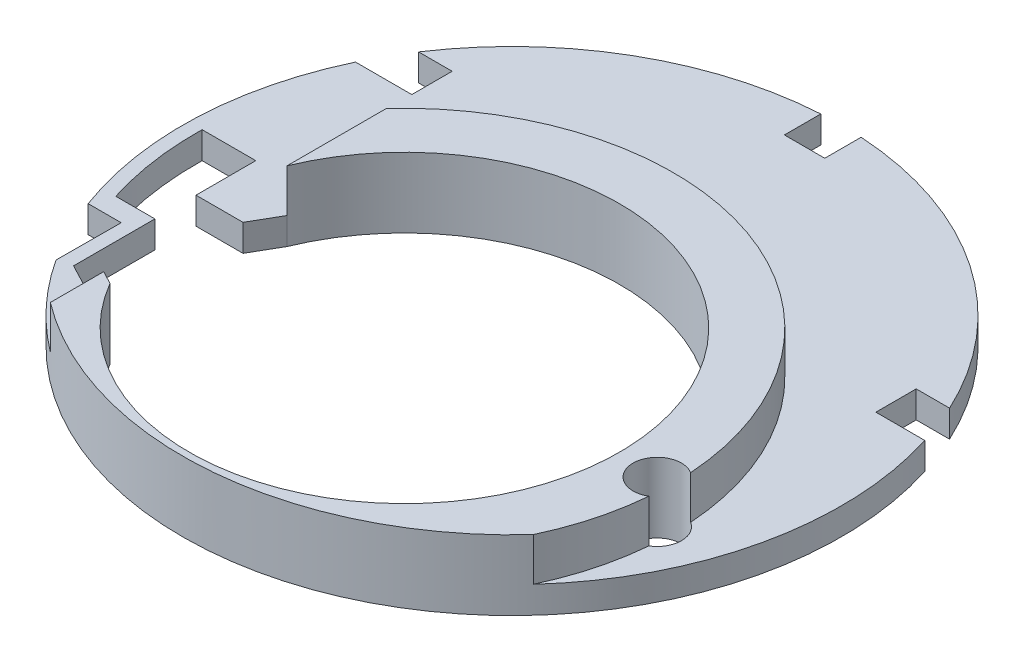
ISO-10303-21;
HEADER;
FILE_DESCRIPTION(('STEP AP214'),'2;1');
FILE_NAME('part.step','',(''),(''),'','','');
FILE_SCHEMA(('AUTOMOTIVE_DESIGN { 1 0 10303 214 1 1 1 1 }'));
ENDSEC;
DATA;
#1=APPLICATION_CONTEXT('core data for automotive mechanical design processes');
#2=APPLICATION_PROTOCOL_DEFINITION('international standard','automotive_design',2000,#1);
#3=PRODUCT_CONTEXT('',#1,'mechanical');
#4=PRODUCT('Part','Part','',(#3));
#5=PRODUCT_RELATED_PRODUCT_CATEGORY('part','',(#4));
#6=PRODUCT_DEFINITION_FORMATION('','',#4);
#7=PRODUCT_DEFINITION_CONTEXT('part definition',#1,'design');
#8=PRODUCT_DEFINITION('design','',#6,#7);
#9=PRODUCT_DEFINITION_SHAPE('','',#8);
#10=(LENGTH_UNIT() NAMED_UNIT(*) SI_UNIT(.MILLI.,.METRE.));
#11=(NAMED_UNIT(*) PLANE_ANGLE_UNIT() SI_UNIT($,.RADIAN.));
#12=(NAMED_UNIT(*) SI_UNIT($,.STERADIAN.) SOLID_ANGLE_UNIT());
#13=UNCERTAINTY_MEASURE_WITH_UNIT(LENGTH_MEASURE(1.E-05),#10,'distance_accuracy_value','');
#14=(GEOMETRIC_REPRESENTATION_CONTEXT(3) GLOBAL_UNCERTAINTY_ASSIGNED_CONTEXT((#13)) GLOBAL_UNIT_ASSIGNED_CONTEXT((#10,
#11,#12)) REPRESENTATION_CONTEXT('',''));
#15=CARTESIAN_POINT('',(0.,0.,0.));
#16=DIRECTION('',(0.,0.,1.));
#17=DIRECTION('',(1.,0.,0.));
#18=AXIS2_PLACEMENT_3D('',#15,#16,#17);
#19=CARTESIAN_POINT('',(0.,1.,0.));
#20=DIRECTION('',(0.,1.,0.));
#21=DIRECTION('',(0.,0.,1.));
#22=AXIS2_PLACEMENT_3D('',#19,#20,#21);
#23=PLANE('',#22);
#24=CARTESIAN_POINT('',(9.5,1.,4.1));
#25=DIRECTION('',(0.,1.,0.));
#26=DIRECTION('',(0.,0.,1.));
#27=AXIS2_PLACEMENT_3D('',#24,#25,#26);
#28=CIRCLE('',#27,0.9);
#29=CARTESIAN_POINT('',(9.96186896058168,1.,4.87244874474053));
#30=VERTEX_POINT('',#29);
#31=CARTESIAN_POINT('',(9.97802689583312,1.,3.33744489585332));
#32=VERTEX_POINT('',#31);
#33=EDGE_CURVE('E498',#30,#32,#28,.T.);
#34=ORIENTED_EDGE('',*,*,#33,.F.);
#35=CARTESIAN_POINT('',(0.,1.,4.));
#36=DIRECTION('',(0.,1.,0.));
#37=DIRECTION('',(0.,0.,1.));
#38=AXIS2_PLACEMENT_3D('',#35,#36,#37);
#39=CIRCLE('',#38,10.);
#40=CARTESIAN_POINT('',(9.04826130893907,1.,8.2578125));
#41=VERTEX_POINT('',#40);
#42=EDGE_CURVE('E266',#41,#30,#39,.T.);
#43=ORIENTED_EDGE('',*,*,#42,.F.);
#44=CARTESIAN_POINT('',(0.,1.,0.));
#45=DIRECTION('',(0.,1.,0.));
#46=DIRECTION('',(0.,0.,1.));
#47=AXIS2_PLACEMENT_3D('',#44,#45,#46);
#48=CIRCLE('',#47,12.25);
#49=CARTESIAN_POINT('',(11.6935879865848,1.,-3.65));
#50=VERTEX_POINT('',#49);
#51=EDGE_CURVE('E317',#41,#50,#48,.T.);
#52=ORIENTED_EDGE('',*,*,#51,.T.);
#53=DIRECTION('',(1.,0.,0.));
#54=VECTOR('',#53,1.);
#55=CARTESIAN_POINT('',(0.,1.,-3.65));
#56=LINE('',#55,#54);
#57=CARTESIAN_POINT('',(9.875,1.,-3.65));
#58=VERTEX_POINT('',#57);
#59=EDGE_CURVE('E321',#58,#50,#56,.T.);
#60=ORIENTED_EDGE('',*,*,#59,.F.);
#61=DIRECTION('',(0.,0.,1.));
#62=VECTOR('',#61,1.);
#63=CARTESIAN_POINT('',(9.875,1.,0.));
#64=LINE('',#63,#62);
#65=CARTESIAN_POINT('',(9.875,1.,-5.15));
#66=VERTEX_POINT('',#65);
#67=EDGE_CURVE('E324',#66,#58,#64,.T.);
#68=ORIENTED_EDGE('',*,*,#67,.F.);
#69=DIRECTION('',(-1.,0.,0.));
#70=VECTOR('',#69,1.);
#71=CARTESIAN_POINT('',(0.,1.,-5.15));
#72=LINE('',#71,#70);
#73=CARTESIAN_POINT('',(11.1148549248292,1.,-5.15));
#74=VERTEX_POINT('',#73);
#75=EDGE_CURVE('E287',#74,#66,#72,.T.);
#76=ORIENTED_EDGE('',*,*,#75,.F.);
#77=CARTESIAN_POINT('',(0.,1.,0.));
#78=DIRECTION('',(0.,1.,0.));
#79=DIRECTION('',(0.,0.,1.));
#80=AXIS2_PLACEMENT_3D('',#77,#78,#79);
#81=CIRCLE('',#80,12.25);
#82=CARTESIAN_POINT('',(0.750000000000014,1.,-12.2270192606375));
#83=VERTEX_POINT('',#82);
#84=EDGE_CURVE('E290',#74,#83,#81,.T.);
#85=ORIENTED_EDGE('',*,*,#84,.T.);
#86=DIRECTION('',(0.,0.,1.));
#87=VECTOR('',#86,1.);
#88=CARTESIAN_POINT('',(0.750000000000014,1.,0.));
#89=LINE('',#88,#87);
#90=CARTESIAN_POINT('',(0.750000000000014,1.,-10.875));
#91=VERTEX_POINT('',#90);
#92=EDGE_CURVE('E293',#83,#91,#89,.T.);
#93=ORIENTED_EDGE('',*,*,#92,.T.);
#94=DIRECTION('',(-1.,0.,0.));
#95=VECTOR('',#94,1.);
#96=CARTESIAN_POINT('',(0.,1.,-10.875));
#97=LINE('',#96,#95);
#98=CARTESIAN_POINT('',(-0.75,1.,-10.875));
#99=VERTEX_POINT('',#98);
#100=EDGE_CURVE('E295',#91,#99,#97,.T.);
#101=ORIENTED_EDGE('',*,*,#100,.T.);
#102=DIRECTION('',(0.,0.,1.));
#103=VECTOR('',#102,1.);
#104=CARTESIAN_POINT('',(-0.75,1.,0.));
#105=LINE('',#104,#103);
#106=CARTESIAN_POINT('',(-0.75,1.,-12.2270192606375));
#107=VERTEX_POINT('',#106);
#108=EDGE_CURVE('E297',#107,#99,#105,.T.);
#109=ORIENTED_EDGE('',*,*,#108,.F.);
#110=CARTESIAN_POINT('',(0.,1.,0.));
#111=DIRECTION('',(0.,1.,0.));
#112=DIRECTION('',(0.,0.,1.));
#113=AXIS2_PLACEMENT_3D('',#110,#111,#112);
#114=CIRCLE('',#113,12.25);
#115=CARTESIAN_POINT('',(-10.2225241501304,1.,-6.75));
#116=VERTEX_POINT('',#115);
#117=EDGE_CURVE('E300',#107,#116,#114,.T.);
#118=ORIENTED_EDGE('',*,*,#117,.T.);
#119=DIRECTION('',(-1.,0.,0.));
#120=VECTOR('',#119,1.);
#121=CARTESIAN_POINT('',(0.,1.,-6.75));
#122=LINE('',#121,#120);
#123=CARTESIAN_POINT('',(-8.975,1.,-6.75));
#124=VERTEX_POINT('',#123);
#125=EDGE_CURVE('E302',#124,#116,#122,.T.);
#126=ORIENTED_EDGE('',*,*,#125,.F.);
#127=DIRECTION('',(0.,0.,-1.));
#128=VECTOR('',#127,1.);
#129=CARTESIAN_POINT('',(-8.975,1.,0.));
#130=LINE('',#129,#128);
#131=CARTESIAN_POINT('',(-8.975,1.,-5.25));
#132=VERTEX_POINT('',#131);
#133=EDGE_CURVE('E305',#132,#124,#130,.T.);
#134=ORIENTED_EDGE('',*,*,#133,.F.);
#135=DIRECTION('',(1.,0.,0.));
#136=VECTOR('',#135,1.);
#137=CARTESIAN_POINT('',(0.,1.,-5.25));
#138=LINE('',#137,#136);
#139=CARTESIAN_POINT('',(-11.0679718105893,1.,-5.25));
#140=VERTEX_POINT('',#139);
#141=EDGE_CURVE('E308',#140,#132,#138,.T.);
#142=ORIENTED_EDGE('',*,*,#141,.F.);
#143=CARTESIAN_POINT('',(0.,1.,0.));
#144=DIRECTION('',(0.,1.,0.));
#145=DIRECTION('',(0.,0.,1.));
#146=AXIS2_PLACEMENT_3D('',#143,#144,#145);
#147=CIRCLE('',#146,12.25);
#148=CARTESIAN_POINT('',(-11.4790342257143,1.,4.27718052516836));
#149=VERTEX_POINT('',#148);
#150=EDGE_CURVE('E311',#140,#149,#147,.T.);
#151=ORIENTED_EDGE('',*,*,#150,.T.);
#152=DIRECTION('',(1.,0.,0.));
#153=VECTOR('',#152,1.);
#154=CARTESIAN_POINT('',(0.,1.,4.27718052516836));
#155=LINE('',#154,#153);
#156=CARTESIAN_POINT('',(-10.2514545589878,1.,4.27718052516836));
#157=VERTEX_POINT('',#156);
#158=EDGE_CURVE('E313',#149,#157,#155,.T.);
#159=ORIENTED_EDGE('',*,*,#158,.T.);
#160=DIRECTION('',(-0.00436090798290692,0.,0.999990491195574));
#161=VECTOR('',#160,1.);
#162=CARTESIAN_POINT('',(-10.2326073884271,1.,-0.0446238835659257));
#163=LINE('',#162,#161);
#164=CARTESIAN_POINT('',(-10.2619761707598,1.,6.68986883808334));
#165=VERTEX_POINT('',#164);
#166=EDGE_CURVE('E315',#157,#165,#163,.T.);
#167=ORIENTED_EDGE('',*,*,#166,.T.);
#168=CARTESIAN_POINT('',(-7.40072006886185,1.,9.76175406688498));
#169=VERTEX_POINT('',#168);
#170=EDGE_CURVE('E318',#165,#169,#48,.T.);
#171=ORIENTED_EDGE('',*,*,#170,.T.);
#172=DIRECTION('',(0.,0.,1.));
#173=VECTOR('',#172,1.);
#174=CARTESIAN_POINT('',(-7.40072006886185,1.,0.));
#175=LINE('',#174,#173);
#176=CARTESIAN_POINT('',(-7.40072006886185,1.,7.77903892333875));
#177=VERTEX_POINT('',#176);
#178=EDGE_CURVE('E273',#177,#169,#175,.T.);
#179=ORIENTED_EDGE('',*,*,#178,.F.);
#180=DIRECTION('',(0.88614169265924,0.,0.463414393961838));
#181=VECTOR('',#180,1.);
#182=CARTESIAN_POINT('',(-4.78379477823256,1.,9.14757948253657));
#183=LINE('',#182,#181);
#184=CARTESIAN_POINT('',(-9.74797336221939,1.,6.5515253423538));
#185=VERTEX_POINT('',#184);
#186=EDGE_CURVE('E503',#185,#177,#183,.T.);
#187=ORIENTED_EDGE('',*,*,#186,.F.);
#188=DIRECTION('',(0.,0.,1.));
#189=VECTOR('',#188,1.);
#190=CARTESIAN_POINT('',(-9.74797336221939,1.,0.));
#191=LINE('',#190,#189);
#192=CARTESIAN_POINT('',(-9.74797336221939,1.,3.52718052516836));
#193=VERTEX_POINT('',#192);
#194=EDGE_CURVE('E488',#193,#185,#191,.T.);
#195=ORIENTED_EDGE('',*,*,#194,.F.);
#196=DIRECTION('',(1.,0.,0.));
#197=VECTOR('',#196,1.);
#198=CARTESIAN_POINT('',(0.,1.,3.52718052516836));
#199=LINE('',#198,#197);
#200=CARTESIAN_POINT('',(-11.2028776001934,1.,3.52718052516836));
#201=VERTEX_POINT('',#200);
#202=EDGE_CURVE('E490',#201,#193,#199,.T.);
#203=ORIENTED_EDGE('',*,*,#202,.F.);
#204=CARTESIAN_POINT('',(0.,1.,0.));
#205=DIRECTION('',(0.,1.,0.));
#206=DIRECTION('',(0.,0.,1.));
#207=AXIS2_PLACEMENT_3D('',#204,#205,#206);
#208=CIRCLE('',#207,11.7450189008806);
#209=CARTESIAN_POINT('',(-11.7429051117549,1.,-0.222819474831643));
#210=VERTEX_POINT('',#209);
#211=EDGE_CURVE('E492',#210,#201,#208,.T.);
#212=ORIENTED_EDGE('',*,*,#211,.F.);
#213=DIRECTION('',(-1.,0.,0.));
#214=VECTOR('',#213,1.);
#215=CARTESIAN_POINT('',(0.,1.,-0.222819474831645));
#216=LINE('',#215,#214);
#217=CARTESIAN_POINT('',(-9.74797336221939,1.,-0.222819474831644));
#218=VERTEX_POINT('',#217);
#219=EDGE_CURVE('E482',#218,#210,#216,.T.);
#220=ORIENTED_EDGE('',*,*,#219,.F.);
#221=DIRECTION('',(0.,0.,-1.));
#222=VECTOR('',#221,1.);
#223=CARTESIAN_POINT('',(-9.74797336221939,1.,0.));
#224=LINE('',#223,#222);
#225=CARTESIAN_POINT('',(-9.74797336221939,1.,2.));
#226=VERTEX_POINT('',#225);
#227=EDGE_CURVE('E484',#226,#218,#224,.T.);
#228=ORIENTED_EDGE('',*,*,#227,.F.);
#229=DIRECTION('',(-1.,0.,0.));
#230=VECTOR('',#229,1.);
#231=CARTESIAN_POINT('',(0.,1.,2.));
#232=LINE('',#231,#230);
#233=CARTESIAN_POINT('',(-8.,1.,2.));
#234=VERTEX_POINT('',#233);
#235=EDGE_CURVE('E486',#234,#226,#232,.T.);
#236=ORIENTED_EDGE('',*,*,#235,.F.);
#237=DIRECTION('',(0.499999999999997,0.,-0.86602540378444));
#238=VECTOR('',#237,1.);
#239=CARTESIAN_POINT('',(-5.13397459621559,1.,-2.96410161513775));
#240=LINE('',#239,#238);
#241=CARTESIAN_POINT('',(-7.40072006886183,1.,0.962016711312303));
#242=VERTEX_POINT('',#241);
#243=EDGE_CURVE('E494',#234,#242,#240,.T.);
#244=ORIENTED_EDGE('',*,*,#243,.T.);
#245=DIRECTION('',(0.,0.,-1.));
#246=VECTOR('',#245,1.);
#247=CARTESIAN_POINT('',(-7.40072006886183,1.,0.));
#248=LINE('',#247,#246);
#249=CARTESIAN_POINT('',(-7.40072006886183,1.,-2.72527638557299));
#250=VERTEX_POINT('',#249);
#251=EDGE_CURVE('E269',#242,#250,#248,.T.);
#252=ORIENTED_EDGE('',*,*,#251,.T.);
#253=EDGE_CURVE('E270',#32,#250,#39,.T.);
#254=ORIENTED_EDGE('',*,*,#253,.F.);
#255=EDGE_LOOP('',(#34,#43,#52,#60,#68,#76,#85,#93,#101,#109,#118,#126,#134,#142,#151,#159,#167,
#171,#179,#187,#195,#203,#212,#220,#228,#236,#244,#252,#254));
#256=FACE_BOUND('',#255,.T.);
#257=ADVANCED_FACE('F35',(#256),#23,.T.);
#258=CARTESIAN_POINT('',(0.,2.6,4.));
#259=DIRECTION('',(0.,-1.,0.));
#260=DIRECTION('',(0.,0.,-1.));
#261=AXIS2_PLACEMENT_3D('',#258,#259,#260);
#262=CYLINDRICAL_SURFACE('',#261,10.);
#263=ORIENTED_EDGE('',*,*,#42,.T.);
#264=DIRECTION('',(0.,1.,0.));
#265=VECTOR('',#264,1.);
#266=CARTESIAN_POINT('',(9.96186896058167,1.3,4.87244874474052));
#267=LINE('',#266,#265);
#268=CARTESIAN_POINT('',(9.96186896058167,2.6,4.87244874474052));
#269=VERTEX_POINT('',#268);
#270=EDGE_CURVE('E477',#30,#269,#267,.T.);
#271=ORIENTED_EDGE('',*,*,#270,.T.);
#272=CARTESIAN_POINT('',(0.,2.6,4.));
#273=DIRECTION('',(0.,1.,0.));
#274=DIRECTION('',(0.,0.,1.));
#275=AXIS2_PLACEMENT_3D('',#272,#273,#274);
#276=CIRCLE('',#275,10.);
#277=CARTESIAN_POINT('',(9.04826130893907,2.6,8.2578125));
#278=VERTEX_POINT('',#277);
#279=EDGE_CURVE('E262',#278,#269,#276,.T.);
#280=ORIENTED_EDGE('',*,*,#279,.F.);
#281=DIRECTION('',(0.,-1.,0.));
#282=VECTOR('',#281,1.);
#283=CARTESIAN_POINT('',(9.04826130893907,2.6,8.2578125));
#284=LINE('',#283,#282);
#285=EDGE_CURVE('E283',#278,#41,#284,.T.);
#286=ORIENTED_EDGE('',*,*,#285,.T.);
#287=EDGE_LOOP('',(#263,#271,#280,#286));
#288=FACE_BOUND('',#287,.T.);
#289=ADVANCED_FACE('F473',(#288),#262,.T.);
#290=CARTESIAN_POINT('',(0.,1.,-5.15));
#291=DIRECTION('',(0.,0.,1.));
#292=DIRECTION('',(1.,0.,0.));
#293=AXIS2_PLACEMENT_3D('',#290,#291,#292);
#294=PLANE('',#293);
#295=DIRECTION('',(-1.,0.,0.));
#296=VECTOR('',#295,1.);
#297=CARTESIAN_POINT('',(0.,0.,-5.15));
#298=LINE('',#297,#296);
#299=CARTESIAN_POINT('',(11.1148549248292,0.,-5.15));
#300=VERTEX_POINT('',#299);
#301=CARTESIAN_POINT('',(9.875,0.,-5.15));
#302=VERTEX_POINT('',#301);
#303=EDGE_CURVE('E286',#300,#302,#298,.T.);
#304=ORIENTED_EDGE('',*,*,#303,.F.);
#305=DIRECTION('',(0.,-1.,0.));
#306=VECTOR('',#305,1.);
#307=CARTESIAN_POINT('',(11.1148549248292,1.,-5.15));
#308=LINE('',#307,#306);
#309=EDGE_CURVE('E252',#74,#300,#308,.T.);
#310=ORIENTED_EDGE('',*,*,#309,.F.);
#311=ORIENTED_EDGE('',*,*,#75,.T.);
#312=DIRECTION('',(0.,-1.,0.));
#313=VECTOR('',#312,1.);
#314=CARTESIAN_POINT('',(9.875,1.,-5.15));
#315=LINE('',#314,#313);
#316=EDGE_CURVE('E327',#66,#302,#315,.T.);
#317=ORIENTED_EDGE('',*,*,#316,.T.);
#318=EDGE_LOOP('',(#304,#310,#311,#317));
#319=FACE_BOUND('',#318,.T.);
#320=ADVANCED_FACE('F37',(#319),#294,.T.);
#321=CARTESIAN_POINT('',(0.,1.,0.));
#322=DIRECTION('',(0.,-1.,0.));
#323=DIRECTION('',(0.,0.,-1.));
#324=AXIS2_PLACEMENT_3D('',#321,#322,#323);
#325=CYLINDRICAL_SURFACE('',#324,12.25);
#326=CARTESIAN_POINT('',(0.,0.,0.));
#327=DIRECTION('',(0.,1.,0.));
#328=DIRECTION('',(0.,0.,1.));
#329=AXIS2_PLACEMENT_3D('',#326,#327,#328);
#330=CIRCLE('',#329,12.25);
#331=CARTESIAN_POINT('',(0.750000000000014,0.,-12.2270192606375));
#332=VERTEX_POINT('',#331);
#333=EDGE_CURVE('E330',#300,#332,#330,.T.);
#334=ORIENTED_EDGE('',*,*,#333,.T.);
#335=DIRECTION('',(0.,-1.,0.));
#336=VECTOR('',#335,1.);
#337=CARTESIAN_POINT('',(0.750000000000014,1.,-12.2270192606375));
#338=LINE('',#337,#336);
#339=EDGE_CURVE('E395',#83,#332,#338,.T.);
#340=ORIENTED_EDGE('',*,*,#339,.F.);
#341=ORIENTED_EDGE('',*,*,#84,.F.);
#342=ORIENTED_EDGE('',*,*,#309,.T.);
#343=EDGE_LOOP('',(#334,#340,#341,#342));
#344=FACE_BOUND('',#343,.T.);
#345=ADVANCED_FACE('F401',(#344),#325,.T.);
#346=CARTESIAN_POINT('',(0.750000000000014,1.,0.));
#347=DIRECTION('',(1.,0.,0.));
#348=DIRECTION('',(0.,0.,-1.));
#349=AXIS2_PLACEMENT_3D('',#346,#347,#348);
#350=PLANE('',#349);
#351=DIRECTION('',(0.,0.,1.));
#352=VECTOR('',#351,1.);
#353=CARTESIAN_POINT('',(0.750000000000014,0.,0.));
#354=LINE('',#353,#352);
#355=CARTESIAN_POINT('',(0.750000000000014,0.,-10.875));
#356=VERTEX_POINT('',#355);
#357=EDGE_CURVE('E332',#332,#356,#354,.T.);
#358=ORIENTED_EDGE('',*,*,#357,.T.);
#359=DIRECTION('',(0.,-1.,0.));
#360=VECTOR('',#359,1.);
#361=CARTESIAN_POINT('',(0.750000000000014,1.,-10.875));
#362=LINE('',#361,#360);
#363=EDGE_CURVE('E392',#91,#356,#362,.T.);
#364=ORIENTED_EDGE('',*,*,#363,.F.);
#365=ORIENTED_EDGE('',*,*,#92,.F.);
#366=ORIENTED_EDGE('',*,*,#339,.T.);
#367=EDGE_LOOP('',(#358,#364,#365,#366));
#368=FACE_BOUND('',#367,.T.);
#369=ADVANCED_FACE('F467',(#368),#350,.F.);
#370=CARTESIAN_POINT('',(0.,1.,-10.875));
#371=DIRECTION('',(0.,0.,1.));
#372=DIRECTION('',(1.,0.,0.));
#373=AXIS2_PLACEMENT_3D('',#370,#371,#372);
#374=PLANE('',#373);
#375=DIRECTION('',(-1.,0.,0.));
#376=VECTOR('',#375,1.);
#377=CARTESIAN_POINT('',(0.,0.,-10.875));
#378=LINE('',#377,#376);
#379=CARTESIAN_POINT('',(-0.75,0.,-10.875));
#380=VERTEX_POINT('',#379);
#381=EDGE_CURVE('E334',#356,#380,#378,.T.);
#382=ORIENTED_EDGE('',*,*,#381,.T.);
#383=DIRECTION('',(0.,-1.,0.));
#384=VECTOR('',#383,1.);
#385=CARTESIAN_POINT('',(-0.75,1.,-10.875));
#386=LINE('',#385,#384);
#387=EDGE_CURVE('E390',#99,#380,#386,.T.);
#388=ORIENTED_EDGE('',*,*,#387,.F.);
#389=ORIENTED_EDGE('',*,*,#100,.F.);
#390=ORIENTED_EDGE('',*,*,#363,.T.);
#391=EDGE_LOOP('',(#382,#388,#389,#390));
#392=FACE_BOUND('',#391,.T.);
#393=ADVANCED_FACE('F463',(#392),#374,.F.);
#394=CARTESIAN_POINT('',(-0.75,1.,0.));
#395=DIRECTION('',(1.,0.,0.));
#396=DIRECTION('',(0.,0.,-1.));
#397=AXIS2_PLACEMENT_3D('',#394,#395,#396);
#398=PLANE('',#397);
#399=DIRECTION('',(0.,0.,1.));
#400=VECTOR('',#399,1.);
#401=CARTESIAN_POINT('',(-0.75,0.,0.));
#402=LINE('',#401,#400);
#403=CARTESIAN_POINT('',(-0.75,0.,-12.2270192606375));
#404=VERTEX_POINT('',#403);
#405=EDGE_CURVE('E337',#404,#380,#402,.T.);
#406=ORIENTED_EDGE('',*,*,#405,.F.);
#407=DIRECTION('',(0.,-1.,0.));
#408=VECTOR('',#407,1.);
#409=CARTESIAN_POINT('',(-0.75,1.,-12.2270192606375));
#410=LINE('',#409,#408);
#411=EDGE_CURVE('E388',#107,#404,#410,.T.);
#412=ORIENTED_EDGE('',*,*,#411,.F.);
#413=ORIENTED_EDGE('',*,*,#108,.T.);
#414=ORIENTED_EDGE('',*,*,#387,.T.);
#415=EDGE_LOOP('',(#406,#412,#413,#414));
#416=FACE_BOUND('',#415,.T.);
#417=ADVANCED_FACE('F458',(#416),#398,.T.);
#418=CARTESIAN_POINT('',(0.,1.,0.));
#419=DIRECTION('',(0.,-1.,0.));
#420=DIRECTION('',(0.,0.,-1.));
#421=AXIS2_PLACEMENT_3D('',#418,#419,#420);
#422=CYLINDRICAL_SURFACE('',#421,12.25);
#423=CARTESIAN_POINT('',(0.,0.,0.));
#424=DIRECTION('',(0.,1.,0.));
#425=DIRECTION('',(0.,0.,1.));
#426=AXIS2_PLACEMENT_3D('',#423,#424,#425);
#427=CIRCLE('',#426,12.25);
#428=CARTESIAN_POINT('',(-10.2225241501304,0.,-6.75));
#429=VERTEX_POINT('',#428);
#430=EDGE_CURVE('E340',#404,#429,#427,.T.);
#431=ORIENTED_EDGE('',*,*,#430,.T.);
#432=DIRECTION('',(0.,-1.,0.));
#433=VECTOR('',#432,1.);
#434=CARTESIAN_POINT('',(-10.2225241501304,1.,-6.75));
#435=LINE('',#434,#433);
#436=EDGE_CURVE('E386',#116,#429,#435,.T.);
#437=ORIENTED_EDGE('',*,*,#436,.F.);
#438=ORIENTED_EDGE('',*,*,#117,.F.);
#439=ORIENTED_EDGE('',*,*,#411,.T.);
#440=EDGE_LOOP('',(#431,#437,#438,#439));
#441=FACE_BOUND('',#440,.T.);
#442=ADVANCED_FACE('F455',(#441),#422,.T.);
#443=CARTESIAN_POINT('',(0.,1.,-6.75));
#444=DIRECTION('',(0.,0.,1.));
#445=DIRECTION('',(1.,0.,0.));
#446=AXIS2_PLACEMENT_3D('',#443,#444,#445);
#447=PLANE('',#446);
#448=DIRECTION('',(-1.,0.,0.));
#449=VECTOR('',#448,1.);
#450=CARTESIAN_POINT('',(0.,0.,-6.75));
#451=LINE('',#450,#449);
#452=CARTESIAN_POINT('',(-8.975,0.,-6.75));
#453=VERTEX_POINT('',#452);
#454=EDGE_CURVE('E343',#453,#429,#451,.T.);
#455=ORIENTED_EDGE('',*,*,#454,.F.);
#456=DIRECTION('',(0.,-1.,0.));
#457=VECTOR('',#456,1.);
#458=CARTESIAN_POINT('',(-8.975,1.,-6.75));
#459=LINE('',#458,#457);
#460=EDGE_CURVE('E384',#124,#453,#459,.T.);
#461=ORIENTED_EDGE('',*,*,#460,.F.);
#462=ORIENTED_EDGE('',*,*,#125,.T.);
#463=ORIENTED_EDGE('',*,*,#436,.T.);
#464=EDGE_LOOP('',(#455,#461,#462,#463));
#465=FACE_BOUND('',#464,.T.);
#466=ADVANCED_FACE('F451',(#465),#447,.T.);
#467=CARTESIAN_POINT('',(-8.975,1.,0.));
#468=DIRECTION('',(-1.,0.,0.));
#469=DIRECTION('',(0.,0.,1.));
#470=AXIS2_PLACEMENT_3D('',#467,#468,#469);
#471=PLANE('',#470);
#472=DIRECTION('',(0.,0.,-1.));
#473=VECTOR('',#472,1.);
#474=CARTESIAN_POINT('',(-8.975,0.,0.));
#475=LINE('',#474,#473);
#476=CARTESIAN_POINT('',(-8.975,0.,-5.25));
#477=VERTEX_POINT('',#476);
#478=EDGE_CURVE('E346',#477,#453,#475,.T.);
#479=ORIENTED_EDGE('',*,*,#478,.F.);
#480=DIRECTION('',(0.,-1.,0.));
#481=VECTOR('',#480,1.);
#482=CARTESIAN_POINT('',(-8.975,1.,-5.25));
#483=LINE('',#482,#481);
#484=EDGE_CURVE('E382',#132,#477,#483,.T.);
#485=ORIENTED_EDGE('',*,*,#484,.F.);
#486=ORIENTED_EDGE('',*,*,#133,.T.);
#487=ORIENTED_EDGE('',*,*,#460,.T.);
#488=EDGE_LOOP('',(#479,#485,#486,#487));
#489=FACE_BOUND('',#488,.T.);
#490=ADVANCED_FACE('F447',(#489),#471,.T.);
#491=CARTESIAN_POINT('',(0.,1.,-5.25));
#492=DIRECTION('',(0.,0.,-1.));
#493=DIRECTION('',(-1.,0.,0.));
#494=AXIS2_PLACEMENT_3D('',#491,#492,#493);
#495=PLANE('',#494);
#496=DIRECTION('',(1.,0.,0.));
#497=VECTOR('',#496,1.);
#498=CARTESIAN_POINT('',(0.,0.,-5.25));
#499=LINE('',#498,#497);
#500=CARTESIAN_POINT('',(-11.0679718105893,0.,-5.25));
#501=VERTEX_POINT('',#500);
#502=EDGE_CURVE('E349',#501,#477,#499,.T.);
#503=ORIENTED_EDGE('',*,*,#502,.F.);
#504=DIRECTION('',(0.,-1.,0.));
#505=VECTOR('',#504,1.);
#506=CARTESIAN_POINT('',(-11.0679718105893,1.,-5.25));
#507=LINE('',#506,#505);
#508=EDGE_CURVE('E380',#140,#501,#507,.T.);
#509=ORIENTED_EDGE('',*,*,#508,.F.);
#510=ORIENTED_EDGE('',*,*,#141,.T.);
#511=ORIENTED_EDGE('',*,*,#484,.T.);
#512=EDGE_LOOP('',(#503,#509,#510,#511));
#513=FACE_BOUND('',#512,.T.);
#514=ADVANCED_FACE('F442',(#513),#495,.T.);
#515=CARTESIAN_POINT('',(0.,1.,0.));
#516=DIRECTION('',(0.,-1.,0.));
#517=DIRECTION('',(0.,0.,-1.));
#518=AXIS2_PLACEMENT_3D('',#515,#516,#517);
#519=CYLINDRICAL_SURFACE('',#518,12.25);
#520=CARTESIAN_POINT('',(0.,0.,0.));
#521=DIRECTION('',(0.,1.,0.));
#522=DIRECTION('',(0.,0.,1.));
#523=AXIS2_PLACEMENT_3D('',#520,#521,#522);
#524=CIRCLE('',#523,12.25);
#525=CARTESIAN_POINT('',(-11.4790342257143,0.,4.27718052516836));
#526=VERTEX_POINT('',#525);
#527=EDGE_CURVE('E352',#501,#526,#524,.T.);
#528=ORIENTED_EDGE('',*,*,#527,.T.);
#529=DIRECTION('',(0.,-1.,0.));
#530=VECTOR('',#529,1.);
#531=CARTESIAN_POINT('',(-11.4790342257143,1.,4.27718052516836));
#532=LINE('',#531,#530);
#533=EDGE_CURVE('E377',#149,#526,#532,.T.);
#534=ORIENTED_EDGE('',*,*,#533,.F.);
#535=ORIENTED_EDGE('',*,*,#150,.F.);
#536=ORIENTED_EDGE('',*,*,#508,.T.);
#537=EDGE_LOOP('',(#528,#534,#535,#536));
#538=FACE_BOUND('',#537,.T.);
#539=ADVANCED_FACE('F439',(#538),#519,.T.);
#540=CARTESIAN_POINT('',(0.,1.,4.27718052516836));
#541=DIRECTION('',(0.,0.,-1.));
#542=DIRECTION('',(-1.,0.,0.));
#543=AXIS2_PLACEMENT_3D('',#540,#541,#542);
#544=PLANE('',#543);
#545=DIRECTION('',(1.,0.,0.));
#546=VECTOR('',#545,1.);
#547=CARTESIAN_POINT('',(0.,0.,4.27718052516836));
#548=LINE('',#547,#546);
#549=CARTESIAN_POINT('',(-10.2514545589878,0.,4.27718052516836));
#550=VERTEX_POINT('',#549);
#551=EDGE_CURVE('E354',#526,#550,#548,.T.);
#552=ORIENTED_EDGE('',*,*,#551,.T.);
#553=DIRECTION('',(0.,-1.,0.));
#554=VECTOR('',#553,1.);
#555=CARTESIAN_POINT('',(-10.2514545589878,1.,4.27718052516836));
#556=LINE('',#555,#554);
#557=EDGE_CURVE('E374',#157,#550,#556,.T.);
#558=ORIENTED_EDGE('',*,*,#557,.F.);
#559=ORIENTED_EDGE('',*,*,#158,.F.);
#560=ORIENTED_EDGE('',*,*,#533,.T.);
#561=EDGE_LOOP('',(#552,#558,#559,#560));
#562=FACE_BOUND('',#561,.T.);
#563=ADVANCED_FACE('F434',(#562),#544,.F.);
#564=CARTESIAN_POINT('',(-10.2326073884271,1.,-0.0446238835659257));
#565=DIRECTION('',(0.999990491195574,0.,0.00436090798290692));
#566=DIRECTION('',(0.00436090798290692,0.,-0.999990491195574));
#567=AXIS2_PLACEMENT_3D('',#564,#565,#566);
#568=PLANE('',#567);
#569=DIRECTION('',(-0.00436090798290692,0.,0.999990491195574));
#570=VECTOR('',#569,1.);
#571=CARTESIAN_POINT('',(-10.2326073884271,0.,-0.0446238835659257));
#572=LINE('',#571,#570);
#573=CARTESIAN_POINT('',(-10.2619761707598,0.,6.68986883808334));
#574=VERTEX_POINT('',#573);
#575=EDGE_CURVE('E356',#550,#574,#572,.T.);
#576=ORIENTED_EDGE('',*,*,#575,.T.);
#577=DIRECTION('',(0.,-1.,0.));
#578=VECTOR('',#577,1.);
#579=CARTESIAN_POINT('',(-10.2619761707598,1.,6.68986883808334));
#580=LINE('',#579,#578);
#581=EDGE_CURVE('E371',#165,#574,#580,.T.);
#582=ORIENTED_EDGE('',*,*,#581,.F.);
#583=ORIENTED_EDGE('',*,*,#166,.F.);
#584=ORIENTED_EDGE('',*,*,#557,.T.);
#585=EDGE_LOOP('',(#576,#582,#583,#584));
#586=FACE_BOUND('',#585,.T.);
#587=ADVANCED_FACE('F428',(#586),#568,.F.);
#588=CARTESIAN_POINT('',(0.,1.,0.));
#589=DIRECTION('',(0.,-1.,0.));
#590=DIRECTION('',(0.,0.,-1.));
#591=AXIS2_PLACEMENT_3D('',#588,#589,#590);
#592=CYLINDRICAL_SURFACE('',#591,12.25);
#593=CARTESIAN_POINT('',(0.,0.,0.));
#594=DIRECTION('',(0.,1.,0.));
#595=DIRECTION('',(0.,0.,1.));
#596=AXIS2_PLACEMENT_3D('',#593,#594,#595);
#597=CIRCLE('',#596,12.25);
#598=CARTESIAN_POINT('',(11.6935879865848,0.,-3.65));
#599=VERTEX_POINT('',#598);
#600=EDGE_CURVE('E358',#574,#599,#597,.T.);
#601=ORIENTED_EDGE('',*,*,#600,.T.);
#602=DIRECTION('',(0.,-1.,0.));
#603=VECTOR('',#602,1.);
#604=CARTESIAN_POINT('',(11.6935879865848,1.,-3.65));
#605=LINE('',#604,#603);
#606=EDGE_CURVE('E369',#50,#599,#605,.T.);
#607=ORIENTED_EDGE('',*,*,#606,.F.);
#608=ORIENTED_EDGE('',*,*,#51,.F.);
#609=ORIENTED_EDGE('',*,*,#285,.F.);
#610=CARTESIAN_POINT('',(0.,2.6,0.));
#611=DIRECTION('',(0.,1.,0.));
#612=DIRECTION('',(0.,0.,1.));
#613=AXIS2_PLACEMENT_3D('',#610,#611,#612);
#614=CIRCLE('',#613,12.25);
#615=CARTESIAN_POINT('',(-7.40072006886185,2.6,9.76175406688498));
#616=VERTEX_POINT('',#615);
#617=EDGE_CURVE('E275',#616,#278,#614,.T.);
#618=ORIENTED_EDGE('',*,*,#617,.F.);
#619=DIRECTION('',(0.,-1.,0.));
#620=VECTOR('',#619,1.);
#621=CARTESIAN_POINT('',(-7.40072006886185,2.6,9.76175406688498));
#622=LINE('',#621,#620);
#623=EDGE_CURVE('E260',#616,#169,#622,.T.);
#624=ORIENTED_EDGE('',*,*,#623,.T.);
#625=ORIENTED_EDGE('',*,*,#170,.F.);
#626=ORIENTED_EDGE('',*,*,#581,.T.);
#627=EDGE_LOOP('',(#601,#607,#608,#609,#618,#624,#625,#626));
#628=FACE_BOUND('',#627,.T.);
#629=ADVANCED_FACE('F423',(#628),#592,.T.);
#630=CARTESIAN_POINT('',(0.,1.,-3.65));
#631=DIRECTION('',(0.,0.,-1.));
#632=DIRECTION('',(-1.,0.,0.));
#633=AXIS2_PLACEMENT_3D('',#630,#631,#632);
#634=PLANE('',#633);
#635=DIRECTION('',(1.,0.,0.));
#636=VECTOR('',#635,1.);
#637=CARTESIAN_POINT('',(0.,0.,-3.65));
#638=LINE('',#637,#636);
#639=CARTESIAN_POINT('',(9.875,0.,-3.65));
#640=VERTEX_POINT('',#639);
#641=EDGE_CURVE('E361',#640,#599,#638,.T.);
#642=ORIENTED_EDGE('',*,*,#641,.F.);
#643=DIRECTION('',(0.,-1.,0.));
#644=VECTOR('',#643,1.);
#645=CARTESIAN_POINT('',(9.875,1.,-3.65));
#646=LINE('',#645,#644);
#647=EDGE_CURVE('E367',#58,#640,#646,.T.);
#648=ORIENTED_EDGE('',*,*,#647,.F.);
#649=ORIENTED_EDGE('',*,*,#59,.T.);
#650=ORIENTED_EDGE('',*,*,#606,.T.);
#651=EDGE_LOOP('',(#642,#648,#649,#650));
#652=FACE_BOUND('',#651,.T.);
#653=ADVANCED_FACE('F418',(#652),#634,.T.);
#654=CARTESIAN_POINT('',(9.875,1.,0.));
#655=DIRECTION('',(1.,0.,0.));
#656=DIRECTION('',(0.,0.,-1.));
#657=AXIS2_PLACEMENT_3D('',#654,#655,#656);
#658=PLANE('',#657);
#659=DIRECTION('',(0.,0.,1.));
#660=VECTOR('',#659,1.);
#661=CARTESIAN_POINT('',(9.875,0.,0.));
#662=LINE('',#661,#660);
#663=EDGE_CURVE('E291',#302,#640,#662,.T.);
#664=ORIENTED_EDGE('',*,*,#663,.F.);
#665=ORIENTED_EDGE('',*,*,#316,.F.);
#666=ORIENTED_EDGE('',*,*,#67,.T.);
#667=ORIENTED_EDGE('',*,*,#647,.T.);
#668=EDGE_LOOP('',(#664,#665,#666,#667));
#669=FACE_BOUND('',#668,.T.);
#670=ADVANCED_FACE('F413',(#669),#658,.T.);
#671=CARTESIAN_POINT('',(0.,0.,0.));
#672=DIRECTION('',(0.,1.,0.));
#673=DIRECTION('',(0.,0.,1.));
#674=AXIS2_PLACEMENT_3D('',#671,#672,#673);
#675=PLANE('',#674);
#676=CARTESIAN_POINT('',(9.5,0.,4.1));
#677=DIRECTION('',(0.,1.,0.));
#678=DIRECTION('',(0.,0.,1.));
#679=AXIS2_PLACEMENT_3D('',#676,#677,#678);
#680=CIRCLE('',#679,0.9);
#681=CARTESIAN_POINT('',(9.5,0.,5.));
#682=VERTEX_POINT('',#681);
#683=EDGE_CURVE('E506',#682,#682,#680,.T.);
#684=ORIENTED_EDGE('',*,*,#683,.T.);
#685=EDGE_LOOP('',(#684));
#686=FACE_BOUND('',#685,.T.);
#687=DIRECTION('',(0.,0.,-1.));
#688=VECTOR('',#687,1.);
#689=CARTESIAN_POINT('',(-9.74797336221939,0.,0.));
#690=LINE('',#689,#688);
#691=CARTESIAN_POINT('',(-9.74797336221939,0.,2.));
#692=VERTEX_POINT('',#691);
#693=CARTESIAN_POINT('',(-9.74797336221939,0.,-0.222819474831644));
#694=VERTEX_POINT('',#693);
#695=EDGE_CURVE('E511',#692,#694,#690,.T.);
#696=ORIENTED_EDGE('',*,*,#695,.T.);
#697=DIRECTION('',(-1.,0.,0.));
#698=VECTOR('',#697,1.);
#699=CARTESIAN_POINT('',(0.,0.,-0.222819474831645));
#700=LINE('',#699,#698);
#701=CARTESIAN_POINT('',(-11.7429051117549,0.,-0.222819474831643));
#702=VERTEX_POINT('',#701);
#703=EDGE_CURVE('E545',#694,#702,#700,.T.);
#704=ORIENTED_EDGE('',*,*,#703,.T.);
#705=CARTESIAN_POINT('',(0.,0.,0.));
#706=DIRECTION('',(0.,1.,0.));
#707=DIRECTION('',(0.,0.,1.));
#708=AXIS2_PLACEMENT_3D('',#705,#706,#707);
#709=CIRCLE('',#708,11.7450189008806);
#710=CARTESIAN_POINT('',(-11.2028776001934,0.,3.52718052516836));
#711=VERTEX_POINT('',#710);
#712=EDGE_CURVE('E542',#702,#711,#709,.T.);
#713=ORIENTED_EDGE('',*,*,#712,.T.);
#714=DIRECTION('',(1.,0.,0.));
#715=VECTOR('',#714,1.);
#716=CARTESIAN_POINT('',(0.,0.,3.52718052516836));
#717=LINE('',#716,#715);
#718=CARTESIAN_POINT('',(-9.74797336221939,0.,3.52718052516836));
#719=VERTEX_POINT('',#718);
#720=EDGE_CURVE('E50',#711,#719,#717,.T.);
#721=ORIENTED_EDGE('',*,*,#720,.T.);
#722=DIRECTION('',(0.,0.,1.));
#723=VECTOR('',#722,1.);
#724=CARTESIAN_POINT('',(-9.74797336221939,0.,0.));
#725=LINE('',#724,#723);
#726=CARTESIAN_POINT('',(-9.74797336221939,0.,6.5515253423538));
#727=VERTEX_POINT('',#726);
#728=EDGE_CURVE('E538',#719,#727,#725,.T.);
#729=ORIENTED_EDGE('',*,*,#728,.T.);
#730=DIRECTION('',(0.88614169265924,0.,0.463414393961838));
#731=VECTOR('',#730,1.);
#732=CARTESIAN_POINT('',(-4.78379477823256,0.,9.14757948253657));
#733=LINE('',#732,#731);
#734=CARTESIAN_POINT('',(-6.90638446064511,0.,8.03755540912564));
#735=VERTEX_POINT('',#734);
#736=EDGE_CURVE('E536',#727,#735,#733,.T.);
#737=ORIENTED_EDGE('',*,*,#736,.T.);
#738=CARTESIAN_POINT('',(0.,0.,4.));
#739=DIRECTION('',(0.,1.,0.));
#740=DIRECTION('',(0.,0.,1.));
#741=AXIS2_PLACEMENT_3D('',#738,#739,#740);
#742=CIRCLE('',#741,8.);
#743=CARTESIAN_POINT('',(-7.40072006886183,0.,0.962016711312303));
#744=VERTEX_POINT('',#743);
#745=EDGE_CURVE('E243',#735,#744,#742,.T.);
#746=ORIENTED_EDGE('',*,*,#745,.T.);
#747=DIRECTION('',(0.499999999999997,0.,-0.86602540378444));
#748=VECTOR('',#747,1.);
#749=CARTESIAN_POINT('',(-5.13397459621559,0.,-2.96410161513775));
#750=LINE('',#749,#748);
#751=CARTESIAN_POINT('',(-8.,0.,2.));
#752=VERTEX_POINT('',#751);
#753=EDGE_CURVE('E533',#752,#744,#750,.T.);
#754=ORIENTED_EDGE('',*,*,#753,.F.);
#755=DIRECTION('',(-1.,0.,0.));
#756=VECTOR('',#755,1.);
#757=CARTESIAN_POINT('',(0.,0.,2.));
#758=LINE('',#757,#756);
#759=EDGE_CURVE('E530',#752,#692,#758,.T.);
#760=ORIENTED_EDGE('',*,*,#759,.T.);
#761=EDGE_LOOP('',(#696,#704,#713,#721,#729,#737,#746,#754,#760));
#762=FACE_BOUND('',#761,.T.);
#763=ORIENTED_EDGE('',*,*,#303,.T.);
#764=ORIENTED_EDGE('',*,*,#663,.T.);
#765=ORIENTED_EDGE('',*,*,#641,.T.);
#766=ORIENTED_EDGE('',*,*,#600,.F.);
#767=ORIENTED_EDGE('',*,*,#575,.F.);
#768=ORIENTED_EDGE('',*,*,#551,.F.);
#769=ORIENTED_EDGE('',*,*,#527,.F.);
#770=ORIENTED_EDGE('',*,*,#502,.T.);
#771=ORIENTED_EDGE('',*,*,#478,.T.);
#772=ORIENTED_EDGE('',*,*,#454,.T.);
#773=ORIENTED_EDGE('',*,*,#430,.F.);
#774=ORIENTED_EDGE('',*,*,#405,.T.);
#775=ORIENTED_EDGE('',*,*,#381,.F.);
#776=ORIENTED_EDGE('',*,*,#357,.F.);
#777=ORIENTED_EDGE('',*,*,#333,.F.);
#778=EDGE_LOOP('',(#763,#764,#765,#766,#767,#768,#769,#770,#771,#772,#773,#774,#775,#776,#777));
#779=FACE_BOUND('',#778,.T.);
#780=ADVANCED_FACE('F408',(#686,#762,#779),#675,.F.);
#781=CARTESIAN_POINT('',(9.97802689583312,2.6,3.33744489585331));
#782=VERTEX_POINT('',#781);
#783=CARTESIAN_POINT('',(-7.40072006886183,2.6,-2.72527638557299));
#784=VERTEX_POINT('',#783);
#785=EDGE_CURVE('E478',#782,#784,#276,.T.);
#786=ORIENTED_EDGE('',*,*,#785,.F.);
#787=DIRECTION('',(0.,1.,0.));
#788=VECTOR('',#787,1.);
#789=CARTESIAN_POINT('',(9.97802689583312,1.3,3.33744489585332));
#790=LINE('',#789,#788);
#791=EDGE_CURVE('E500',#782,#32,#790,.F.);
#792=ORIENTED_EDGE('',*,*,#791,.T.);
#793=ORIENTED_EDGE('',*,*,#253,.T.);
#794=DIRECTION('',(0.,-1.,0.));
#795=VECTOR('',#794,1.);
#796=CARTESIAN_POINT('',(-7.40072006886183,2.6,-2.72527638557299));
#797=LINE('',#796,#795);
#798=EDGE_CURVE('E280',#784,#250,#797,.T.);
#799=ORIENTED_EDGE('',*,*,#798,.F.);
#800=EDGE_LOOP('',(#786,#792,#793,#799));
#801=FACE_BOUND('',#800,.T.);
#802=ADVANCED_FACE('F561',(#801),#262,.T.);
#803=CARTESIAN_POINT('',(-7.40072006886183,2.6,0.));
#804=DIRECTION('',(-1.,0.,0.));
#805=DIRECTION('',(0.,0.,1.));
#806=AXIS2_PLACEMENT_3D('',#803,#804,#805);
#807=PLANE('',#806);
#808=ORIENTED_EDGE('',*,*,#251,.F.);
#809=DIRECTION('',(0.,-1.,0.));
#810=VECTOR('',#809,1.);
#811=CARTESIAN_POINT('',(-7.40072006886183,2.6,0.962016711312303));
#812=LINE('',#811,#810);
#813=CARTESIAN_POINT('',(-7.40072006886183,2.6,0.962016711312303));
#814=VERTEX_POINT('',#813);
#815=EDGE_CURVE('E278',#814,#242,#812,.T.);
#816=ORIENTED_EDGE('',*,*,#815,.F.);
#817=DIRECTION('',(0.,0.,-1.));
#818=VECTOR('',#817,1.);
#819=CARTESIAN_POINT('',(-7.40072006886183,2.6,0.));
#820=LINE('',#819,#818);
#821=EDGE_CURVE('E257',#814,#784,#820,.T.);
#822=ORIENTED_EDGE('',*,*,#821,.T.);
#823=ORIENTED_EDGE('',*,*,#798,.T.);
#824=EDGE_LOOP('',(#808,#816,#822,#823));
#825=FACE_BOUND('',#824,.T.);
#826=ADVANCED_FACE('F566',(#825),#807,.T.);
#827=CARTESIAN_POINT('',(0.,2.6,4.));
#828=DIRECTION('',(0.,-1.,0.));
#829=DIRECTION('',(0.,0.,-1.));
#830=AXIS2_PLACEMENT_3D('',#827,#828,#829);
#831=CYLINDRICAL_SURFACE('',#830,8.);
#832=DIRECTION('',(0.,1.,0.));
#833=VECTOR('',#832,1.);
#834=CARTESIAN_POINT('',(-6.90638446064511,0.,8.03755540912564));
#835=LINE('',#834,#833);
#836=CARTESIAN_POINT('',(-6.90638446064511,2.6,8.03755540912564));
#837=VERTEX_POINT('',#836);
#838=EDGE_CURVE('E235',#735,#837,#835,.T.);
#839=ORIENTED_EDGE('',*,*,#838,.T.);
#840=CARTESIAN_POINT('',(0.,2.6,4.));
#841=DIRECTION('',(0.,1.,0.));
#842=DIRECTION('',(0.,0.,1.));
#843=AXIS2_PLACEMENT_3D('',#840,#841,#842);
#844=CIRCLE('',#843,8.);
#845=EDGE_CURVE('E239',#837,#814,#844,.T.);
#846=ORIENTED_EDGE('',*,*,#845,.T.);
#847=ORIENTED_EDGE('',*,*,#815,.T.);
#848=DIRECTION('',(0.,1.,0.));
#849=VECTOR('',#848,1.);
#850=CARTESIAN_POINT('',(-7.40072006886183,0.,0.962016711312303));
#851=LINE('',#850,#849);
#852=EDGE_CURVE('E246',#744,#242,#851,.T.);
#853=ORIENTED_EDGE('',*,*,#852,.F.);
#854=ORIENTED_EDGE('',*,*,#745,.F.);
#855=EDGE_LOOP('',(#839,#846,#847,#853,#854));
#856=FACE_BOUND('',#855,.T.);
#857=ADVANCED_FACE('F236',(#856),#831,.F.);
#858=CARTESIAN_POINT('',(-7.40072006886185,2.6,0.));
#859=DIRECTION('',(1.,0.,0.));
#860=DIRECTION('',(0.,0.,-1.));
#861=AXIS2_PLACEMENT_3D('',#858,#859,#860);
#862=PLANE('',#861);
#863=DIRECTION('',(0.,0.,1.));
#864=VECTOR('',#863,1.);
#865=CARTESIAN_POINT('',(-7.40072006886185,2.6,0.));
#866=LINE('',#865,#864);
#867=CARTESIAN_POINT('',(-7.40072006886185,2.6,7.77903892333875));
#868=VERTEX_POINT('',#867);
#869=EDGE_CURVE('E258',#868,#616,#866,.T.);
#870=ORIENTED_EDGE('',*,*,#869,.F.);
#871=DIRECTION('',(0.,-1.,0.));
#872=VECTOR('',#871,1.);
#873=CARTESIAN_POINT('',(-7.40072006886185,2.6,7.77903892333875));
#874=LINE('',#873,#872);
#875=EDGE_CURVE('E58',#868,#177,#874,.T.);
#876=ORIENTED_EDGE('',*,*,#875,.T.);
#877=ORIENTED_EDGE('',*,*,#178,.T.);
#878=ORIENTED_EDGE('',*,*,#623,.F.);
#879=EDGE_LOOP('',(#870,#876,#877,#878));
#880=FACE_BOUND('',#879,.T.);
#881=ADVANCED_FACE('F576',(#880),#862,.F.);
#882=CARTESIAN_POINT('',(0.,2.6,0.));
#883=DIRECTION('',(0.,1.,0.));
#884=DIRECTION('',(0.,0.,1.));
#885=AXIS2_PLACEMENT_3D('',#882,#883,#884);
#886=PLANE('',#885);
#887=CARTESIAN_POINT('',(9.5,2.6,4.1));
#888=DIRECTION('',(0.,1.,0.));
#889=DIRECTION('',(0.,0.,1.));
#890=AXIS2_PLACEMENT_3D('',#887,#888,#889);
#891=CIRCLE('',#890,0.9);
#892=EDGE_CURVE('E11',#782,#269,#891,.T.);
#893=ORIENTED_EDGE('',*,*,#892,.F.);
#894=ORIENTED_EDGE('',*,*,#785,.T.);
#895=ORIENTED_EDGE('',*,*,#821,.F.);
#896=ORIENTED_EDGE('',*,*,#845,.F.);
#897=DIRECTION('',(0.88614169265924,0.,0.463414393961838));
#898=VECTOR('',#897,1.);
#899=CARTESIAN_POINT('',(-4.78379477823256,2.6,9.14757948253657));
#900=LINE('',#899,#898);
#901=EDGE_CURVE('E43',#868,#837,#900,.T.);
#902=ORIENTED_EDGE('',*,*,#901,.F.);
#903=ORIENTED_EDGE('',*,*,#869,.T.);
#904=ORIENTED_EDGE('',*,*,#617,.T.);
#905=ORIENTED_EDGE('',*,*,#279,.T.);
#906=EDGE_LOOP('',(#893,#894,#895,#896,#902,#903,#904,#905));
#907=FACE_BOUND('',#906,.T.);
#908=ADVANCED_FACE('F255',(#907),#886,.T.);
#909=CARTESIAN_POINT('',(0.,0.,-0.222819474831645));
#910=DIRECTION('',(0.,0.,-1.));
#911=DIRECTION('',(-1.,0.,0.));
#912=AXIS2_PLACEMENT_3D('',#909,#910,#911);
#913=PLANE('',#912);
#914=ORIENTED_EDGE('',*,*,#219,.T.);
#915=DIRECTION('',(0.,1.,0.));
#916=VECTOR('',#915,1.);
#917=CARTESIAN_POINT('',(-11.7429051117549,0.,-0.222819474831643));
#918=LINE('',#917,#916);
#919=EDGE_CURVE('E507',#702,#210,#918,.T.);
#920=ORIENTED_EDGE('',*,*,#919,.F.);
#921=ORIENTED_EDGE('',*,*,#703,.F.);
#922=DIRECTION('',(0.,1.,0.));
#923=VECTOR('',#922,1.);
#924=CARTESIAN_POINT('',(-9.74797336221939,0.,-0.222819474831644));
#925=LINE('',#924,#923);
#926=EDGE_CURVE('E525',#694,#218,#925,.T.);
#927=ORIENTED_EDGE('',*,*,#926,.T.);
#928=EDGE_LOOP('',(#914,#920,#921,#927));
#929=FACE_BOUND('',#928,.T.);
#930=ADVANCED_FACE('F583',(#929),#913,.F.);
#931=CARTESIAN_POINT('',(-9.74797336221939,0.,0.));
#932=DIRECTION('',(1.,0.,0.));
#933=DIRECTION('',(0.,0.,-1.));
#934=AXIS2_PLACEMENT_3D('',#931,#932,#933);
#935=PLANE('',#934);
#936=ORIENTED_EDGE('',*,*,#227,.T.);
#937=ORIENTED_EDGE('',*,*,#926,.F.);
#938=ORIENTED_EDGE('',*,*,#695,.F.);
#939=DIRECTION('',(0.,1.,0.));
#940=VECTOR('',#939,1.);
#941=CARTESIAN_POINT('',(-9.74797336221939,0.,2.));
#942=LINE('',#941,#940);
#943=EDGE_CURVE('E522',#692,#226,#942,.T.);
#944=ORIENTED_EDGE('',*,*,#943,.T.);
#945=EDGE_LOOP('',(#936,#937,#938,#944));
#946=FACE_BOUND('',#945,.T.);
#947=ADVANCED_FACE('F685',(#946),#935,.F.);
#948=CARTESIAN_POINT('',(0.,0.,2.));
#949=DIRECTION('',(0.,0.,-1.));
#950=DIRECTION('',(-1.,0.,0.));
#951=AXIS2_PLACEMENT_3D('',#948,#949,#950);
#952=PLANE('',#951);
#953=ORIENTED_EDGE('',*,*,#235,.T.);
#954=ORIENTED_EDGE('',*,*,#943,.F.);
#955=ORIENTED_EDGE('',*,*,#759,.F.);
#956=DIRECTION('',(0.,1.,0.));
#957=VECTOR('',#956,1.);
#958=CARTESIAN_POINT('',(-8.,0.,2.));
#959=LINE('',#958,#957);
#960=EDGE_CURVE('E519',#752,#234,#959,.T.);
#961=ORIENTED_EDGE('',*,*,#960,.T.);
#962=EDGE_LOOP('',(#953,#954,#955,#961));
#963=FACE_BOUND('',#962,.T.);
#964=ADVANCED_FACE('F695',(#963),#952,.F.);
#965=CARTESIAN_POINT('',(-5.13397459621559,0.,-2.96410161513775));
#966=DIRECTION('',(0.86602540378444,0.,0.499999999999997));
#967=DIRECTION('',(0.499999999999997,0.,-0.86602540378444));
#968=AXIS2_PLACEMENT_3D('',#965,#966,#967);
#969=PLANE('',#968);
#970=ORIENTED_EDGE('',*,*,#960,.F.);
#971=ORIENTED_EDGE('',*,*,#753,.T.);
#972=ORIENTED_EDGE('',*,*,#852,.T.);
#973=ORIENTED_EDGE('',*,*,#243,.F.);
#974=EDGE_LOOP('',(#970,#971,#972,#973));
#975=FACE_BOUND('',#974,.T.);
#976=ADVANCED_FACE('F706',(#975),#969,.T.);
#977=CARTESIAN_POINT('',(-4.78379477823256,0.,9.14757948253657));
#978=DIRECTION('',(-0.463414393961838,0.,0.88614169265924));
#979=DIRECTION('',(0.88614169265924,0.,0.463414393961838));
#980=AXIS2_PLACEMENT_3D('',#977,#978,#979);
#981=PLANE('',#980);
#982=ORIENTED_EDGE('',*,*,#186,.T.);
#983=ORIENTED_EDGE('',*,*,#875,.F.);
#984=ORIENTED_EDGE('',*,*,#901,.T.);
#985=ORIENTED_EDGE('',*,*,#838,.F.);
#986=ORIENTED_EDGE('',*,*,#736,.F.);
#987=DIRECTION('',(0.,1.,0.));
#988=VECTOR('',#987,1.);
#989=CARTESIAN_POINT('',(-9.74797336221939,0.,6.5515253423538));
#990=LINE('',#989,#988);
#991=EDGE_CURVE('E247',#727,#185,#990,.T.);
#992=ORIENTED_EDGE('',*,*,#991,.T.);
#993=EDGE_LOOP('',(#982,#983,#984,#985,#986,#992));
#994=FACE_BOUND('',#993,.T.);
#995=ADVANCED_FACE('F249',(#994),#981,.F.);
#996=CARTESIAN_POINT('',(-9.74797336221939,0.,0.));
#997=DIRECTION('',(-1.,0.,0.));
#998=DIRECTION('',(0.,0.,1.));
#999=AXIS2_PLACEMENT_3D('',#996,#997,#998);
#1000=PLANE('',#999);
#1001=ORIENTED_EDGE('',*,*,#194,.T.);
#1002=ORIENTED_EDGE('',*,*,#991,.F.);
#1003=ORIENTED_EDGE('',*,*,#728,.F.);
#1004=DIRECTION('',(0.,1.,0.));
#1005=VECTOR('',#1004,1.);
#1006=CARTESIAN_POINT('',(-9.74797336221939,0.,3.52718052516836));
#1007=LINE('',#1006,#1005);
#1008=EDGE_CURVE('E513',#719,#193,#1007,.T.);
#1009=ORIENTED_EDGE('',*,*,#1008,.T.);
#1010=EDGE_LOOP('',(#1001,#1002,#1003,#1009));
#1011=FACE_BOUND('',#1010,.T.);
#1012=ADVANCED_FACE('F724',(#1011),#1000,.F.);
#1013=CARTESIAN_POINT('',(0.,0.,3.52718052516836));
#1014=DIRECTION('',(0.,0.,1.));
#1015=DIRECTION('',(1.,0.,0.));
#1016=AXIS2_PLACEMENT_3D('',#1013,#1014,#1015);
#1017=PLANE('',#1016);
#1018=ORIENTED_EDGE('',*,*,#202,.T.);
#1019=ORIENTED_EDGE('',*,*,#1008,.F.);
#1020=ORIENTED_EDGE('',*,*,#720,.F.);
#1021=DIRECTION('',(0.,1.,0.));
#1022=VECTOR('',#1021,1.);
#1023=CARTESIAN_POINT('',(-11.2028776001934,0.,3.52718052516836));
#1024=LINE('',#1023,#1022);
#1025=EDGE_CURVE('E510',#711,#201,#1024,.T.);
#1026=ORIENTED_EDGE('',*,*,#1025,.T.);
#1027=EDGE_LOOP('',(#1018,#1019,#1020,#1026));
#1028=FACE_BOUND('',#1027,.T.);
#1029=ADVANCED_FACE('F733',(#1028),#1017,.F.);
#1030=CARTESIAN_POINT('',(0.,0.,0.));
#1031=DIRECTION('',(0.,1.,0.));
#1032=DIRECTION('',(0.,0.,1.));
#1033=AXIS2_PLACEMENT_3D('',#1030,#1031,#1032);
#1034=CYLINDRICAL_SURFACE('',#1033,11.7450189008806);
#1035=ORIENTED_EDGE('',*,*,#211,.T.);
#1036=ORIENTED_EDGE('',*,*,#1025,.F.);
#1037=ORIENTED_EDGE('',*,*,#712,.F.);
#1038=ORIENTED_EDGE('',*,*,#919,.T.);
#1039=EDGE_LOOP('',(#1035,#1036,#1037,#1038));
#1040=FACE_BOUND('',#1039,.T.);
#1041=ADVANCED_FACE('F556',(#1040),#1034,.F.);
#1042=CARTESIAN_POINT('',(9.5,0.,4.1));
#1043=DIRECTION('',(0.,1.,0.));
#1044=DIRECTION('',(0.,0.,1.));
#1045=AXIS2_PLACEMENT_3D('',#1042,#1043,#1044);
#1046=CYLINDRICAL_SURFACE('',#1045,0.9);
#1047=ORIENTED_EDGE('',*,*,#683,.F.);
#1048=EDGE_LOOP('',(#1047));
#1049=FACE_BOUND('',#1048,.T.);
#1050=ORIENTED_EDGE('',*,*,#33,.T.);
#1051=ORIENTED_EDGE('',*,*,#791,.F.);
#1052=ORIENTED_EDGE('',*,*,#892,.T.);
#1053=ORIENTED_EDGE('',*,*,#270,.F.);
#1054=EDGE_LOOP('',(#1050,#1051,#1052,#1053));
#1055=FACE_BOUND('',#1054,.T.);
#1056=ADVANCED_FACE('F553',(#1049,#1055),#1046,.F.);
#1057=CLOSED_SHELL('',(#257,#289,#320,#345,#369,#393,#417,#442,#466,#490,#514,#539,#563,#587,
#629,#653,#670,#780,#802,#826,#857,#881,#908,#930,#947,#964,#976,#995,#1012,#1029,#1041,#1056));
#1058=MANIFOLD_SOLID_BREP('B2',#1057);
#1059=ADVANCED_BREP_SHAPE_REPRESENTATION('',(#18,#1058),#14);
#1060=SHAPE_DEFINITION_REPRESENTATION(#9,#1059);
ENDSEC;
END-ISO-10303-21;
